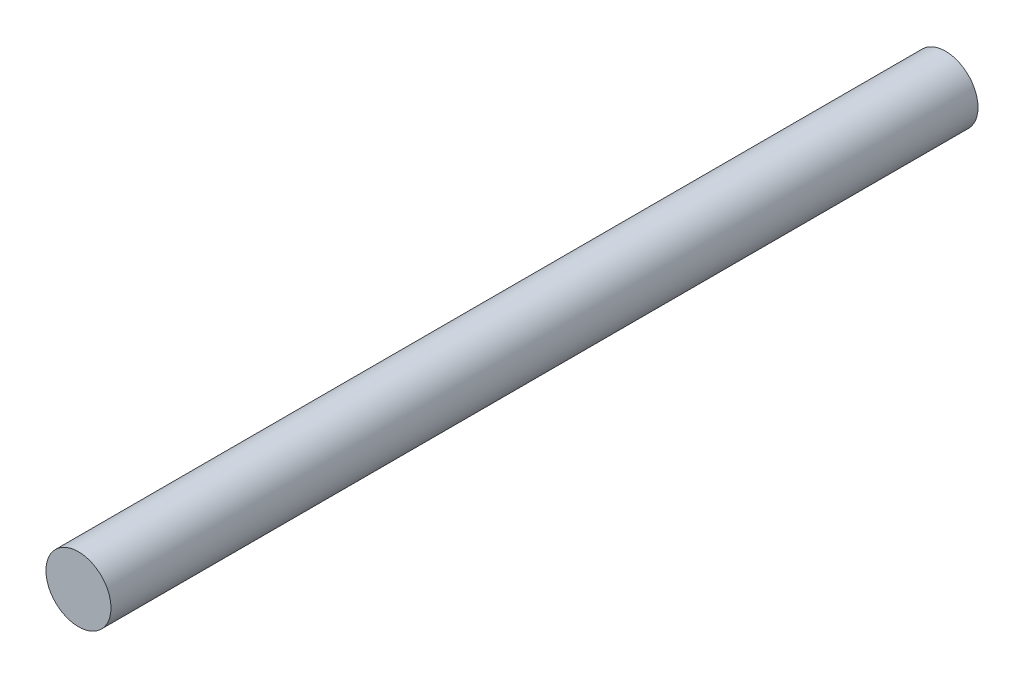
ISO-10303-21;
HEADER;
FILE_DESCRIPTION(('STEP AP214'),'2;1');
FILE_NAME('part.step','',(''),(''),'','','');
FILE_SCHEMA(('AUTOMOTIVE_DESIGN { 1 0 10303 214 1 1 1 1 }'));
ENDSEC;
DATA;
#1=APPLICATION_CONTEXT('core data for automotive mechanical design processes');
#2=APPLICATION_PROTOCOL_DEFINITION('international standard','automotive_design',2000,#1);
#3=PRODUCT_CONTEXT('',#1,'mechanical');
#4=PRODUCT('Part','Part','',(#3));
#5=PRODUCT_RELATED_PRODUCT_CATEGORY('part','',(#4));
#6=PRODUCT_DEFINITION_FORMATION('','',#4);
#7=PRODUCT_DEFINITION_CONTEXT('part definition',#1,'design');
#8=PRODUCT_DEFINITION('design','',#6,#7);
#9=PRODUCT_DEFINITION_SHAPE('','',#8);
#10=(LENGTH_UNIT() NAMED_UNIT(*) SI_UNIT(.MILLI.,.METRE.));
#11=(NAMED_UNIT(*) PLANE_ANGLE_UNIT() SI_UNIT($,.RADIAN.));
#12=(NAMED_UNIT(*) SI_UNIT($,.STERADIAN.) SOLID_ANGLE_UNIT());
#13=UNCERTAINTY_MEASURE_WITH_UNIT(LENGTH_MEASURE(1.E-05),#10,'distance_accuracy_value','');
#14=(GEOMETRIC_REPRESENTATION_CONTEXT(3) GLOBAL_UNCERTAINTY_ASSIGNED_CONTEXT((#13)) GLOBAL_UNIT_ASSIGNED_CONTEXT((#10,
#11,#12)) REPRESENTATION_CONTEXT('',''));
#15=CARTESIAN_POINT('',(0.,0.,0.));
#16=DIRECTION('',(0.,0.,1.));
#17=DIRECTION('',(1.,0.,0.));
#18=AXIS2_PLACEMENT_3D('',#15,#16,#17);
#19=CARTESIAN_POINT('',(0.,0.,1000.));
#20=DIRECTION('',(0.,0.,-1.));
#21=DIRECTION('',(-1.,0.,0.));
#22=AXIS2_PLACEMENT_3D('',#19,#20,#21);
#23=CYLINDRICAL_SURFACE('',#22,37.5);
#24=CARTESIAN_POINT('',(0.,0.,1000.));
#25=DIRECTION('',(0.,0.,1.));
#26=DIRECTION('',(1.,0.,0.));
#27=AXIS2_PLACEMENT_3D('',#24,#25,#26);
#28=CIRCLE('',#27,37.5);
#29=CARTESIAN_POINT('',(37.5,0.,1000.));
#30=VERTEX_POINT('',#29);
#31=EDGE_CURVE('E10',#30,#30,#28,.T.);
#32=ORIENTED_EDGE('',*,*,#31,.F.);
#33=EDGE_LOOP('',(#32));
#34=FACE_BOUND('',#33,.T.);
#35=CARTESIAN_POINT('',(0.,0.,0.));
#36=DIRECTION('',(0.,0.,1.));
#37=DIRECTION('',(1.,0.,0.));
#38=AXIS2_PLACEMENT_3D('',#35,#36,#37);
#39=CIRCLE('',#38,37.5);
#40=CARTESIAN_POINT('',(37.5,0.,0.));
#41=VERTEX_POINT('',#40);
#42=EDGE_CURVE('E38',#41,#41,#39,.T.);
#43=ORIENTED_EDGE('',*,*,#42,.T.);
#44=EDGE_LOOP('',(#43));
#45=FACE_BOUND('',#44,.T.);
#46=ADVANCED_FACE('F35',(#34,#45),#23,.T.);
#47=CARTESIAN_POINT('',(0.,0.,1000.));
#48=DIRECTION('',(0.,0.,1.));
#49=DIRECTION('',(1.,0.,0.));
#50=AXIS2_PLACEMENT_3D('',#47,#48,#49);
#51=PLANE('',#50);
#52=ORIENTED_EDGE('',*,*,#31,.T.);
#53=EDGE_LOOP('',(#52));
#54=FACE_BOUND('',#53,.T.);
#55=ADVANCED_FACE('F50',(#54),#51,.T.);
#56=CARTESIAN_POINT('',(0.,0.,0.));
#57=DIRECTION('',(0.,0.,1.));
#58=DIRECTION('',(1.,0.,0.));
#59=AXIS2_PLACEMENT_3D('',#56,#57,#58);
#60=PLANE('',#59);
#61=ORIENTED_EDGE('',*,*,#42,.F.);
#62=EDGE_LOOP('',(#61));
#63=FACE_BOUND('',#62,.T.);
#64=ADVANCED_FACE('F48',(#63),#60,.F.);
#65=CLOSED_SHELL('',(#46,#55,#64));
#66=MANIFOLD_SOLID_BREP('B2',#65);
#67=ADVANCED_BREP_SHAPE_REPRESENTATION('',(#18,#66),#14);
#68=SHAPE_DEFINITION_REPRESENTATION(#9,#67);
ENDSEC;
END-ISO-10303-21;
